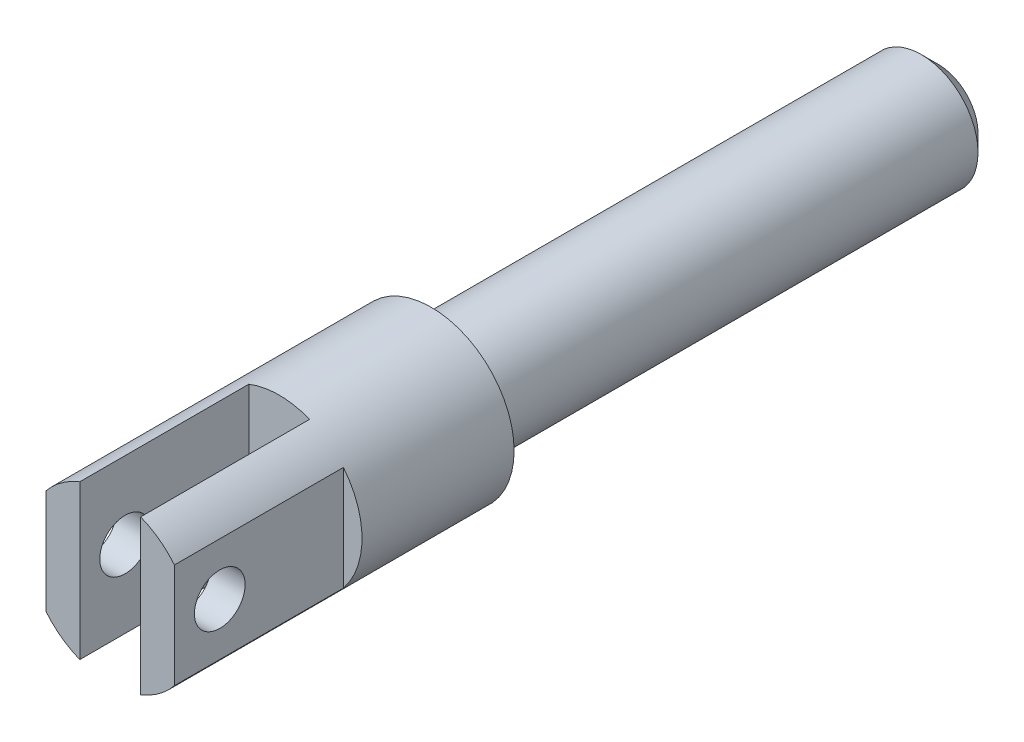
ISO-10303-21;
HEADER;
FILE_DESCRIPTION(('STEP AP214'),'2;1');
FILE_NAME('part.step','',(''),(''),'','','');
FILE_SCHEMA(('AUTOMOTIVE_DESIGN { 1 0 10303 214 1 1 1 1 }'));
ENDSEC;
DATA;
#1=APPLICATION_CONTEXT('core data for automotive mechanical design processes');
#2=APPLICATION_PROTOCOL_DEFINITION('international standard','automotive_design',2000,#1);
#3=PRODUCT_CONTEXT('',#1,'mechanical');
#4=PRODUCT('Part','Part','',(#3));
#5=PRODUCT_RELATED_PRODUCT_CATEGORY('part','',(#4));
#6=PRODUCT_DEFINITION_FORMATION('','',#4);
#7=PRODUCT_DEFINITION_CONTEXT('part definition',#1,'design');
#8=PRODUCT_DEFINITION('design','',#6,#7);
#9=PRODUCT_DEFINITION_SHAPE('','',#8);
#10=(LENGTH_UNIT() NAMED_UNIT(*) SI_UNIT(.MILLI.,.METRE.));
#11=(NAMED_UNIT(*) PLANE_ANGLE_UNIT() SI_UNIT($,.RADIAN.));
#12=(NAMED_UNIT(*) SI_UNIT($,.STERADIAN.) SOLID_ANGLE_UNIT());
#13=UNCERTAINTY_MEASURE_WITH_UNIT(LENGTH_MEASURE(1.E-05),#10,'distance_accuracy_value','');
#14=(GEOMETRIC_REPRESENTATION_CONTEXT(3) GLOBAL_UNCERTAINTY_ASSIGNED_CONTEXT((#13)) GLOBAL_UNIT_ASSIGNED_CONTEXT((#10,
#11,#12)) REPRESENTATION_CONTEXT('',''));
#15=CARTESIAN_POINT('',(0.,0.,0.));
#16=DIRECTION('',(0.,0.,1.));
#17=DIRECTION('',(1.,0.,0.));
#18=AXIS2_PLACEMENT_3D('',#15,#16,#17);
#19=CARTESIAN_POINT('',(0.,0.,0.));
#20=DIRECTION('',(0.,0.,1.));
#21=DIRECTION('',(1.,0.,0.));
#22=AXIS2_PLACEMENT_3D('',#19,#20,#21);
#23=PLANE('',#22);
#24=CARTESIAN_POINT('',(0.,0.,0.));
#25=DIRECTION('',(0.,0.,1.));
#26=DIRECTION('',(1.,0.,0.));
#27=AXIS2_PLACEMENT_3D('',#24,#25,#26);
#28=CIRCLE('',#27,4.9);
#29=CARTESIAN_POINT('',(4.9,0.,0.));
#30=VERTEX_POINT('',#29);
#31=EDGE_CURVE('E161',#30,#30,#28,.T.);
#32=ORIENTED_EDGE('',*,*,#31,.F.);
#33=EDGE_LOOP('',(#32));
#34=FACE_BOUND('',#33,.T.);
#35=CARTESIAN_POINT('',(0.,0.,0.));
#36=DIRECTION('',(0.,0.,1.));
#37=DIRECTION('',(1.,0.,0.));
#38=AXIS2_PLACEMENT_3D('',#35,#36,#37);
#39=CIRCLE('',#38,3.35);
#40=CARTESIAN_POINT('',(3.35,0.,0.));
#41=VERTEX_POINT('',#40);
#42=EDGE_CURVE('E182',#41,#41,#39,.F.);
#43=ORIENTED_EDGE('',*,*,#42,.F.);
#44=EDGE_LOOP('',(#43));
#45=FACE_BOUND('',#44,.T.);
#46=ADVANCED_FACE('F34',(#34,#45),#23,.F.);
#47=CARTESIAN_POINT('',(0.,0.,9.));
#48=DIRECTION('',(0.,0.,1.));
#49=DIRECTION('',(1.,0.,0.));
#50=AXIS2_PLACEMENT_3D('',#47,#48,#49);
#51=PLANE('',#50);
#52=CARTESIAN_POINT('',(0.,0.,9.));
#53=DIRECTION('',(0.,0.,1.));
#54=DIRECTION('',(1.,0.,0.));
#55=AXIS2_PLACEMENT_3D('',#52,#53,#54);
#56=CIRCLE('',#55,4.9);
#57=CARTESIAN_POINT('',(-3.8,3.09354165965161,9.));
#58=VERTEX_POINT('',#57);
#59=CARTESIAN_POINT('',(-3.8,-3.09354165965161,9.));
#60=VERTEX_POINT('',#59);
#61=EDGE_CURVE('E125',#58,#60,#56,.T.);
#62=ORIENTED_EDGE('',*,*,#61,.T.);
#63=DIRECTION('',(0.,-1.,0.));
#64=VECTOR('',#63,1.);
#65=CARTESIAN_POINT('',(-3.8,-3.09354165965161,9.));
#66=LINE('',#65,#64);
#67=EDGE_CURVE('E204',#58,#60,#66,.T.);
#68=ORIENTED_EDGE('',*,*,#67,.F.);
#69=EDGE_LOOP('',(#62,#68));
#70=FACE_BOUND('',#69,.T.);
#71=ADVANCED_FACE('F222',(#70),#51,.T.);
#72=CARTESIAN_POINT('',(1.8,4.55741154604234,9.));
#73=VERTEX_POINT('',#72);
#74=CARTESIAN_POINT('',(-1.8,4.55741154604234,9.));
#75=VERTEX_POINT('',#74);
#76=EDGE_CURVE('E174',#73,#75,#56,.T.);
#77=ORIENTED_EDGE('',*,*,#76,.T.);
#78=DIRECTION('',(0.,1.,0.));
#79=VECTOR('',#78,1.);
#80=CARTESIAN_POINT('',(-1.8,-4.55741154604234,9.));
#81=LINE('',#80,#79);
#82=CARTESIAN_POINT('',(-1.8,-4.55741154604234,9.));
#83=VERTEX_POINT('',#82);
#84=EDGE_CURVE('E118',#83,#75,#81,.T.);
#85=ORIENTED_EDGE('',*,*,#84,.F.);
#86=CARTESIAN_POINT('',(1.8,-4.55741154604234,9.));
#87=VERTEX_POINT('',#86);
#88=EDGE_CURVE('E175',#83,#87,#56,.T.);
#89=ORIENTED_EDGE('',*,*,#88,.T.);
#90=DIRECTION('',(0.,-1.,0.));
#91=VECTOR('',#90,1.);
#92=CARTESIAN_POINT('',(1.8,-4.55741154604234,9.));
#93=LINE('',#92,#91);
#94=EDGE_CURVE('E126',#73,#87,#93,.T.);
#95=ORIENTED_EDGE('',*,*,#94,.F.);
#96=EDGE_LOOP('',(#77,#85,#89,#95));
#97=FACE_BOUND('',#96,.T.);
#98=ADVANCED_FACE('F214',(#97),#51,.T.);
#99=DIRECTION('',(0.,1.,0.));
#100=VECTOR('',#99,1.);
#101=CARTESIAN_POINT('',(3.8,-3.09354165965161,9.));
#102=LINE('',#101,#100);
#103=CARTESIAN_POINT('',(3.8,-3.09354165965161,9.));
#104=VERTEX_POINT('',#103);
#105=CARTESIAN_POINT('',(3.8,3.09354165965161,9.));
#106=VERTEX_POINT('',#105);
#107=EDGE_CURVE('E56',#104,#106,#102,.T.);
#108=ORIENTED_EDGE('',*,*,#107,.F.);
#109=EDGE_CURVE('E149',#104,#106,#56,.T.);
#110=ORIENTED_EDGE('',*,*,#109,.T.);
#111=EDGE_LOOP('',(#108,#110));
#112=FACE_BOUND('',#111,.T.);
#113=ADVANCED_FACE('F229',(#112),#51,.T.);
#114=CARTESIAN_POINT('',(0.,0.,9.));
#115=DIRECTION('',(0.,0.,-1.));
#116=DIRECTION('',(-1.,0.,0.));
#117=AXIS2_PLACEMENT_3D('',#114,#115,#116);
#118=CYLINDRICAL_SURFACE('',#117,4.9);
#119=ORIENTED_EDGE('',*,*,#76,.F.);
#120=DIRECTION('',(0.,0.,-1.));
#121=VECTOR('',#120,1.);
#122=CARTESIAN_POINT('',(1.8,4.55741154604234,19.));
#123=LINE('',#122,#121);
#124=CARTESIAN_POINT('',(1.8,4.55741154604234,19.));
#125=VERTEX_POINT('',#124);
#126=EDGE_CURVE('E155',#125,#73,#123,.T.);
#127=ORIENTED_EDGE('',*,*,#126,.F.);
#128=CARTESIAN_POINT('',(0.,0.,19.));
#129=DIRECTION('',(0.,0.,1.));
#130=DIRECTION('',(1.,0.,0.));
#131=AXIS2_PLACEMENT_3D('',#128,#129,#130);
#132=CIRCLE('',#131,4.9);
#133=CARTESIAN_POINT('',(3.8,3.09354165965161,19.));
#134=VERTEX_POINT('',#133);
#135=EDGE_CURVE('E133',#134,#125,#132,.T.);
#136=ORIENTED_EDGE('',*,*,#135,.F.);
#137=DIRECTION('',(0.,0.,-1.));
#138=VECTOR('',#137,1.);
#139=CARTESIAN_POINT('',(3.8,3.09354165965161,19.));
#140=LINE('',#139,#138);
#141=EDGE_CURVE('E142',#134,#106,#140,.T.);
#142=ORIENTED_EDGE('',*,*,#141,.T.);
#143=ORIENTED_EDGE('',*,*,#109,.F.);
#144=DIRECTION('',(0.,0.,-1.));
#145=VECTOR('',#144,1.);
#146=CARTESIAN_POINT('',(3.8,-3.09354165965161,19.));
#147=LINE('',#146,#145);
#148=CARTESIAN_POINT('',(3.8,-3.09354165965161,19.));
#149=VERTEX_POINT('',#148);
#150=EDGE_CURVE('E156',#149,#104,#147,.T.);
#151=ORIENTED_EDGE('',*,*,#150,.F.);
#152=CARTESIAN_POINT('',(0.,0.,19.));
#153=DIRECTION('',(0.,0.,1.));
#154=DIRECTION('',(1.,0.,0.));
#155=AXIS2_PLACEMENT_3D('',#152,#153,#154);
#156=CIRCLE('',#155,4.9);
#157=CARTESIAN_POINT('',(1.8,-4.55741154604234,19.));
#158=VERTEX_POINT('',#157);
#159=EDGE_CURVE('E138',#158,#149,#156,.T.);
#160=ORIENTED_EDGE('',*,*,#159,.F.);
#161=DIRECTION('',(0.,0.,-1.));
#162=VECTOR('',#161,1.);
#163=CARTESIAN_POINT('',(1.8,-4.55741154604234,19.));
#164=LINE('',#163,#162);
#165=EDGE_CURVE('E152',#158,#87,#164,.T.);
#166=ORIENTED_EDGE('',*,*,#165,.T.);
#167=ORIENTED_EDGE('',*,*,#88,.F.);
#168=DIRECTION('',(0.,0.,-1.));
#169=VECTOR('',#168,1.);
#170=CARTESIAN_POINT('',(-1.8,-4.55741154604234,19.));
#171=LINE('',#170,#169);
#172=CARTESIAN_POINT('',(-1.8,-4.55741154604234,19.));
#173=VERTEX_POINT('',#172);
#174=EDGE_CURVE('E49',#173,#83,#171,.T.);
#175=ORIENTED_EDGE('',*,*,#174,.F.);
#176=CARTESIAN_POINT('',(0.,0.,19.));
#177=DIRECTION('',(0.,0.,1.));
#178=DIRECTION('',(1.,0.,0.));
#179=AXIS2_PLACEMENT_3D('',#176,#177,#178);
#180=CIRCLE('',#179,4.9);
#181=CARTESIAN_POINT('',(-3.8,-3.09354165965161,19.));
#182=VERTEX_POINT('',#181);
#183=EDGE_CURVE('E109',#182,#173,#180,.T.);
#184=ORIENTED_EDGE('',*,*,#183,.F.);
#185=DIRECTION('',(0.,0.,-1.));
#186=VECTOR('',#185,1.);
#187=CARTESIAN_POINT('',(-3.8,-3.09354165965161,19.));
#188=LINE('',#187,#186);
#189=EDGE_CURVE('E106',#182,#60,#188,.T.);
#190=ORIENTED_EDGE('',*,*,#189,.T.);
#191=ORIENTED_EDGE('',*,*,#61,.F.);
#192=DIRECTION('',(0.,0.,-1.));
#193=VECTOR('',#192,1.);
#194=CARTESIAN_POINT('',(-3.8,3.09354165965161,19.));
#195=LINE('',#194,#193);
#196=CARTESIAN_POINT('',(-3.8,3.09354165965161,19.));
#197=VERTEX_POINT('',#196);
#198=EDGE_CURVE('E103',#197,#58,#195,.T.);
#199=ORIENTED_EDGE('',*,*,#198,.F.);
#200=CARTESIAN_POINT('',(0.,0.,19.));
#201=DIRECTION('',(0.,0.,1.));
#202=DIRECTION('',(1.,0.,0.));
#203=AXIS2_PLACEMENT_3D('',#200,#201,#202);
#204=CIRCLE('',#203,4.9);
#205=CARTESIAN_POINT('',(-1.8,4.55741154604234,19.));
#206=VERTEX_POINT('',#205);
#207=EDGE_CURVE('E110',#206,#197,#204,.T.);
#208=ORIENTED_EDGE('',*,*,#207,.F.);
#209=DIRECTION('',(0.,0.,-1.));
#210=VECTOR('',#209,1.);
#211=CARTESIAN_POINT('',(-1.8,4.55741154604234,19.));
#212=LINE('',#211,#210);
#213=EDGE_CURVE('E208',#206,#75,#212,.T.);
#214=ORIENTED_EDGE('',*,*,#213,.T.);
#215=EDGE_LOOP('',(#119,#127,#136,#142,#143,#151,#160,#166,#167,#175,#184,#190,#191,#199,#208,#214));
#216=FACE_BOUND('',#215,.T.);
#217=ORIENTED_EDGE('',*,*,#31,.T.);
#218=EDGE_LOOP('',(#217));
#219=FACE_BOUND('',#218,.T.);
#220=ADVANCED_FACE('F122',(#216,#219),#118,.T.);
#221=CARTESIAN_POINT('',(1.8,-4.55741154604234,19.));
#222=DIRECTION('',(1.,0.,0.));
#223=DIRECTION('',(0.,0.,-1.));
#224=AXIS2_PLACEMENT_3D('',#221,#222,#223);
#225=PLANE('',#224);
#226=CARTESIAN_POINT('',(1.8,0.,16.3188145856226));
#227=DIRECTION('',(1.,0.,0.));
#228=DIRECTION('',(0.,0.,-1.));
#229=AXIS2_PLACEMENT_3D('',#226,#227,#228);
#230=CIRCLE('',#229,1.5);
#231=CARTESIAN_POINT('',(1.8,0.,14.8188145856226));
#232=VERTEX_POINT('',#231);
#233=EDGE_CURVE('E196',#232,#232,#230,.T.);
#234=ORIENTED_EDGE('',*,*,#233,.T.);
#235=EDGE_LOOP('',(#234));
#236=FACE_BOUND('',#235,.T.);
#237=ORIENTED_EDGE('',*,*,#94,.T.);
#238=ORIENTED_EDGE('',*,*,#165,.F.);
#239=DIRECTION('',(0.,-1.,0.));
#240=VECTOR('',#239,1.);
#241=CARTESIAN_POINT('',(1.8,-4.55741154604234,19.));
#242=LINE('',#241,#240);
#243=EDGE_CURVE('E136',#125,#158,#242,.T.);
#244=ORIENTED_EDGE('',*,*,#243,.F.);
#245=ORIENTED_EDGE('',*,*,#126,.T.);
#246=EDGE_LOOP('',(#237,#238,#244,#245));
#247=FACE_BOUND('',#246,.T.);
#248=ADVANCED_FACE('F232',(#236,#247),#225,.F.);
#249=CARTESIAN_POINT('',(3.8,-3.09354165965161,19.));
#250=DIRECTION('',(-1.,0.,0.));
#251=DIRECTION('',(0.,0.,1.));
#252=AXIS2_PLACEMENT_3D('',#249,#250,#251);
#253=PLANE('',#252);
#254=CARTESIAN_POINT('',(3.8,0.,16.3188145856226));
#255=DIRECTION('',(-1.,0.,0.));
#256=DIRECTION('',(0.,0.,1.));
#257=AXIS2_PLACEMENT_3D('',#254,#255,#256);
#258=CIRCLE('',#257,1.5);
#259=CARTESIAN_POINT('',(3.8,0.,17.8188145856226));
#260=VERTEX_POINT('',#259);
#261=EDGE_CURVE('E191',#260,#260,#258,.T.);
#262=ORIENTED_EDGE('',*,*,#261,.T.);
#263=EDGE_LOOP('',(#262));
#264=FACE_BOUND('',#263,.T.);
#265=ORIENTED_EDGE('',*,*,#107,.T.);
#266=ORIENTED_EDGE('',*,*,#141,.F.);
#267=DIRECTION('',(0.,1.,0.));
#268=VECTOR('',#267,1.);
#269=CARTESIAN_POINT('',(3.8,-3.09354165965161,19.));
#270=LINE('',#269,#268);
#271=EDGE_CURVE('E140',#149,#134,#270,.T.);
#272=ORIENTED_EDGE('',*,*,#271,.F.);
#273=ORIENTED_EDGE('',*,*,#150,.T.);
#274=EDGE_LOOP('',(#265,#266,#272,#273));
#275=FACE_BOUND('',#274,.T.);
#276=ADVANCED_FACE('F237',(#264,#275),#253,.F.);
#277=CARTESIAN_POINT('',(0.,0.,19.));
#278=DIRECTION('',(0.,0.,1.));
#279=DIRECTION('',(1.,0.,0.));
#280=AXIS2_PLACEMENT_3D('',#277,#278,#279);
#281=PLANE('',#280);
#282=ORIENTED_EDGE('',*,*,#135,.T.);
#283=ORIENTED_EDGE('',*,*,#243,.T.);
#284=ORIENTED_EDGE('',*,*,#159,.T.);
#285=ORIENTED_EDGE('',*,*,#271,.T.);
#286=EDGE_LOOP('',(#282,#283,#284,#285));
#287=FACE_BOUND('',#286,.T.);
#288=ADVANCED_FACE('F284',(#287),#281,.T.);
#289=CARTESIAN_POINT('',(-3.8,-3.09354165965161,19.));
#290=DIRECTION('',(1.,0.,0.));
#291=DIRECTION('',(0.,0.,-1.));
#292=AXIS2_PLACEMENT_3D('',#289,#290,#291);
#293=PLANE('',#292);
#294=CARTESIAN_POINT('',(-3.8,0.,16.3188145856226));
#295=DIRECTION('',(-1.,0.,0.));
#296=DIRECTION('',(0.,0.,1.));
#297=AXIS2_PLACEMENT_3D('',#294,#295,#296);
#298=CIRCLE('',#297,1.5);
#299=CARTESIAN_POINT('',(-3.8,0.,17.8188145856226));
#300=VERTEX_POINT('',#299);
#301=EDGE_CURVE('E192',#300,#300,#298,.T.);
#302=ORIENTED_EDGE('',*,*,#301,.F.);
#303=EDGE_LOOP('',(#302));
#304=FACE_BOUND('',#303,.T.);
#305=ORIENTED_EDGE('',*,*,#67,.T.);
#306=ORIENTED_EDGE('',*,*,#189,.F.);
#307=DIRECTION('',(0.,-1.,0.));
#308=VECTOR('',#307,1.);
#309=CARTESIAN_POINT('',(-3.8,-3.09354165965161,19.));
#310=LINE('',#309,#308);
#311=EDGE_CURVE('E99',#197,#182,#310,.T.);
#312=ORIENTED_EDGE('',*,*,#311,.F.);
#313=ORIENTED_EDGE('',*,*,#198,.T.);
#314=EDGE_LOOP('',(#305,#306,#312,#313));
#315=FACE_BOUND('',#314,.T.);
#316=ADVANCED_FACE('F101',(#304,#315),#293,.F.);
#317=CARTESIAN_POINT('',(-1.8,-4.55741154604234,19.));
#318=DIRECTION('',(-1.,0.,0.));
#319=DIRECTION('',(0.,0.,1.));
#320=AXIS2_PLACEMENT_3D('',#317,#318,#319);
#321=PLANE('',#320);
#322=CARTESIAN_POINT('',(-1.8,0.,16.3188145856226));
#323=DIRECTION('',(-1.,0.,0.));
#324=DIRECTION('',(0.,0.,1.));
#325=AXIS2_PLACEMENT_3D('',#322,#323,#324);
#326=CIRCLE('',#325,1.5);
#327=CARTESIAN_POINT('',(-1.8,0.,17.8188145856226));
#328=VERTEX_POINT('',#327);
#329=EDGE_CURVE('E189',#328,#328,#326,.T.);
#330=ORIENTED_EDGE('',*,*,#329,.T.);
#331=EDGE_LOOP('',(#330));
#332=FACE_BOUND('',#331,.T.);
#333=ORIENTED_EDGE('',*,*,#84,.T.);
#334=ORIENTED_EDGE('',*,*,#213,.F.);
#335=DIRECTION('',(0.,1.,0.));
#336=VECTOR('',#335,1.);
#337=CARTESIAN_POINT('',(-1.8,-4.55741154604234,19.));
#338=LINE('',#337,#336);
#339=EDGE_CURVE('E114',#173,#206,#338,.T.);
#340=ORIENTED_EDGE('',*,*,#339,.F.);
#341=ORIENTED_EDGE('',*,*,#174,.T.);
#342=EDGE_LOOP('',(#333,#334,#340,#341));
#343=FACE_BOUND('',#342,.T.);
#344=ADVANCED_FACE('F212',(#332,#343),#321,.F.);
#345=CARTESIAN_POINT('',(0.,0.,19.));
#346=DIRECTION('',(0.,0.,1.));
#347=DIRECTION('',(1.,0.,0.));
#348=AXIS2_PLACEMENT_3D('',#345,#346,#347);
#349=PLANE('',#348);
#350=ORIENTED_EDGE('',*,*,#207,.T.);
#351=ORIENTED_EDGE('',*,*,#311,.T.);
#352=ORIENTED_EDGE('',*,*,#183,.T.);
#353=ORIENTED_EDGE('',*,*,#339,.T.);
#354=EDGE_LOOP('',(#350,#351,#352,#353));
#355=FACE_BOUND('',#354,.T.);
#356=ADVANCED_FACE('F113',(#355),#349,.T.);
#357=CARTESIAN_POINT('',(4.900025,0.,16.3188145856226));
#358=DIRECTION('',(-1.,0.,0.));
#359=DIRECTION('',(0.,0.,1.));
#360=AXIS2_PLACEMENT_3D('',#357,#358,#359);
#361=CYLINDRICAL_SURFACE('',#360,1.5);
#362=ORIENTED_EDGE('',*,*,#301,.T.);
#363=EDGE_LOOP('',(#362));
#364=FACE_BOUND('',#363,.T.);
#365=ORIENTED_EDGE('',*,*,#329,.F.);
#366=EDGE_LOOP('',(#365));
#367=FACE_BOUND('',#366,.T.);
#368=ADVANCED_FACE('F315',(#364,#367),#361,.F.);
#369=ORIENTED_EDGE('',*,*,#261,.F.);
#370=EDGE_LOOP('',(#369));
#371=FACE_BOUND('',#370,.T.);
#372=ORIENTED_EDGE('',*,*,#233,.F.);
#373=EDGE_LOOP('',(#372));
#374=FACE_BOUND('',#373,.T.);
#375=ADVANCED_FACE('F322',(#371,#374),#361,.F.);
#376=CARTESIAN_POINT('',(0.,0.,-30.));
#377=DIRECTION('',(0.,0.,1.));
#378=DIRECTION('',(1.,0.,0.));
#379=AXIS2_PLACEMENT_3D('',#376,#377,#378);
#380=CYLINDRICAL_SURFACE('',#379,3.35);
#381=CARTESIAN_POINT('',(0.,0.,-29.));
#382=DIRECTION('',(0.,0.,-1.));
#383=DIRECTION('',(-1.,0.,0.));
#384=AXIS2_PLACEMENT_3D('',#381,#382,#383);
#385=CIRCLE('',#384,3.35);
#386=CARTESIAN_POINT('',(-3.35,0.,-29.));
#387=VERTEX_POINT('',#386);
#388=EDGE_CURVE('E11',#387,#387,#385,.F.);
#389=ORIENTED_EDGE('',*,*,#388,.T.);
#390=EDGE_LOOP('',(#389));
#391=FACE_BOUND('',#390,.T.);
#392=ORIENTED_EDGE('',*,*,#42,.T.);
#393=EDGE_LOOP('',(#392));
#394=FACE_BOUND('',#393,.T.);
#395=ADVANCED_FACE('F330',(#391,#394),#380,.T.);
#396=CARTESIAN_POINT('',(0.,0.,-30.));
#397=DIRECTION('',(0.,0.,-1.));
#398=DIRECTION('',(-1.,0.,0.));
#399=AXIS2_PLACEMENT_3D('',#396,#397,#398);
#400=PLANE('',#399);
#401=CARTESIAN_POINT('',(0.,0.,-30.));
#402=DIRECTION('',(0.,0.,-1.));
#403=DIRECTION('',(-1.,0.,0.));
#404=AXIS2_PLACEMENT_3D('',#401,#402,#403);
#405=CIRCLE('',#404,2.35000000000001);
#406=CARTESIAN_POINT('',(-2.35000000000001,0.,-30.));
#407=VERTEX_POINT('',#406);
#408=EDGE_CURVE('E42',#407,#407,#405,.T.);
#409=ORIENTED_EDGE('',*,*,#408,.T.);
#410=EDGE_LOOP('',(#409));
#411=FACE_BOUND('',#410,.T.);
#412=ADVANCED_FACE('F342',(#411),#400,.T.);
#413=CARTESIAN_POINT('',(0.,0.,-30.));
#414=DIRECTION('',(0.,0.,1.));
#415=DIRECTION('',(1.,0.,0.));
#416=AXIS2_PLACEMENT_3D('',#413,#414,#415);
#417=CONICAL_SURFACE('',#416,2.35000000000001,0.785398163397442);
#418=ORIENTED_EDGE('',*,*,#388,.F.);
#419=EDGE_LOOP('',(#418));
#420=FACE_BOUND('',#419,.T.);
#421=ORIENTED_EDGE('',*,*,#408,.F.);
#422=EDGE_LOOP('',(#421));
#423=FACE_BOUND('',#422,.T.);
#424=ADVANCED_FACE('F36',(#420,#423),#417,.T.);
#425=CLOSED_SHELL('',(#46,#71,#98,#113,#220,#248,#276,#288,#316,#344,#356,#368,#375,#395,#412,#424));
#426=MANIFOLD_SOLID_BREP('B2',#425);
#427=ADVANCED_BREP_SHAPE_REPRESENTATION('',(#18,#426),#14);
#428=SHAPE_DEFINITION_REPRESENTATION(#9,#427);
ENDSEC;
END-ISO-10303-21;
